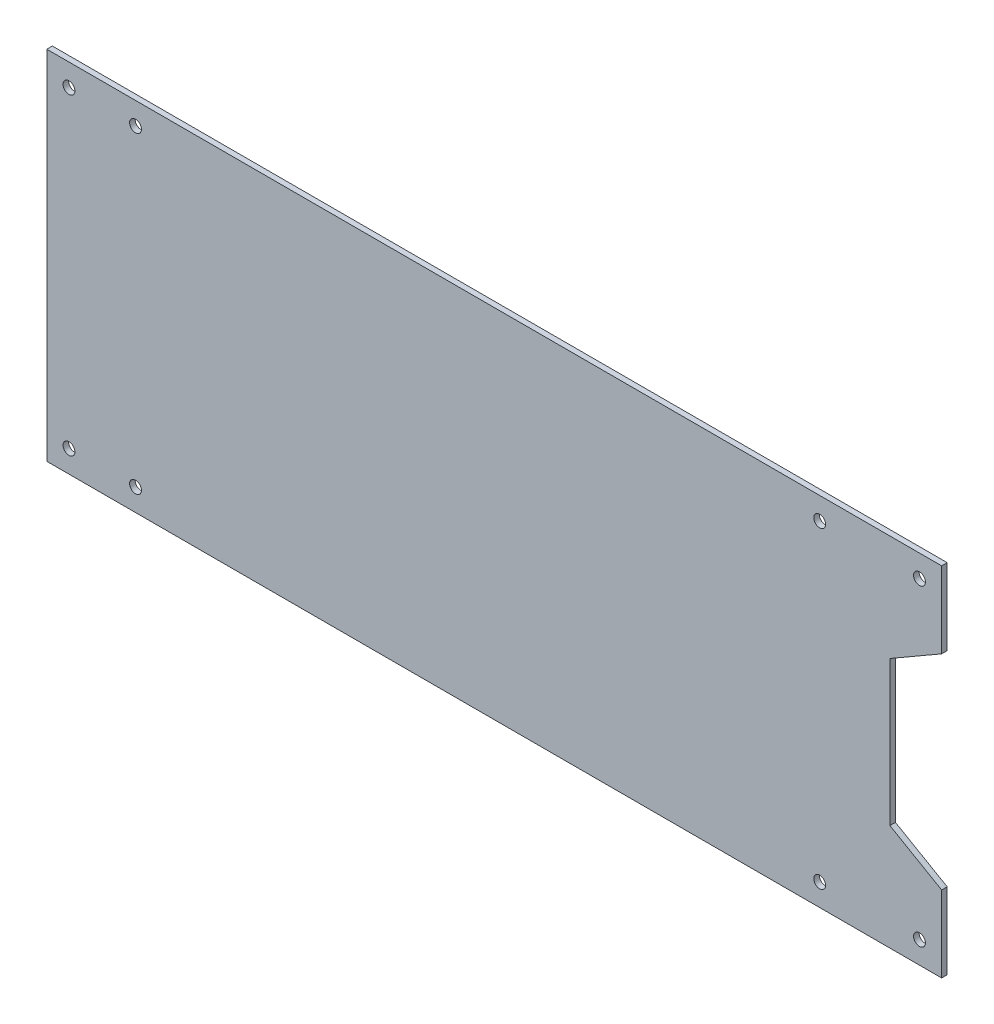
ISO-10303-21;
HEADER;
FILE_DESCRIPTION(('STEP AP214'),'2;1');
FILE_NAME('part.step','',(''),(''),'','','');
FILE_SCHEMA(('AUTOMOTIVE_DESIGN { 1 0 10303 214 1 1 1 1 }'));
ENDSEC;
DATA;
#1=APPLICATION_CONTEXT('core data for automotive mechanical design processes');
#2=APPLICATION_PROTOCOL_DEFINITION('international standard','automotive_design',2000,#1);
#3=PRODUCT_CONTEXT('',#1,'mechanical');
#4=PRODUCT('Part','Part','',(#3));
#5=PRODUCT_RELATED_PRODUCT_CATEGORY('part','',(#4));
#6=PRODUCT_DEFINITION_FORMATION('','',#4);
#7=PRODUCT_DEFINITION_CONTEXT('part definition',#1,'design');
#8=PRODUCT_DEFINITION('design','',#6,#7);
#9=PRODUCT_DEFINITION_SHAPE('','',#8);
#10=(LENGTH_UNIT() NAMED_UNIT(*) SI_UNIT(.MILLI.,.METRE.));
#11=(NAMED_UNIT(*) PLANE_ANGLE_UNIT() SI_UNIT($,.RADIAN.));
#12=(NAMED_UNIT(*) SI_UNIT($,.STERADIAN.) SOLID_ANGLE_UNIT());
#13=UNCERTAINTY_MEASURE_WITH_UNIT(LENGTH_MEASURE(1.E-05),#10,'distance_accuracy_value','');
#14=(GEOMETRIC_REPRESENTATION_CONTEXT(3) GLOBAL_UNCERTAINTY_ASSIGNED_CONTEXT((#13)) GLOBAL_UNIT_ASSIGNED_CONTEXT((#10,
#11,#12)) REPRESENTATION_CONTEXT('',''));
#15=CARTESIAN_POINT('',(0.,0.,0.));
#16=DIRECTION('',(0.,0.,1.));
#17=DIRECTION('',(1.,0.,0.));
#18=AXIS2_PLACEMENT_3D('',#15,#16,#17);
#19=CARTESIAN_POINT('',(-828.47776474,608.080871165908,1.5));
#20=DIRECTION('',(1.,0.,0.));
#21=DIRECTION('',(0.,0.,-1.));
#22=AXIS2_PLACEMENT_3D('',#19,#20,#21);
#23=PLANE('',#22);
#24=DIRECTION('',(0.,-1.,0.));
#25=VECTOR('',#24,1.);
#26=CARTESIAN_POINT('',(-828.47776474,608.080871165908,0.));
#27=LINE('',#26,#25);
#28=CARTESIAN_POINT('',(-828.47776474,608.080871165908,0.));
#29=VERTEX_POINT('',#28);
#30=CARTESIAN_POINT('',(-828.47776474,511.53002929687,0.));
#31=VERTEX_POINT('',#30);
#32=EDGE_CURVE('E142',#29,#31,#27,.T.);
#33=ORIENTED_EDGE('',*,*,#32,.T.);
#34=DIRECTION('',(0.,0.,-1.));
#35=VECTOR('',#34,1.);
#36=CARTESIAN_POINT('',(-828.47776474,511.53002929687,1.5));
#37=LINE('',#36,#35);
#38=CARTESIAN_POINT('',(-828.47776474,511.53002929687,1.5));
#39=VERTEX_POINT('',#38);
#40=EDGE_CURVE('E13',#39,#31,#37,.T.);
#41=ORIENTED_EDGE('',*,*,#40,.F.);
#42=DIRECTION('',(0.,-1.,0.));
#43=VECTOR('',#42,1.);
#44=CARTESIAN_POINT('',(-828.47776474,608.080871165908,1.5));
#45=LINE('',#44,#43);
#46=CARTESIAN_POINT('',(-828.47776474,608.080871165908,1.5));
#47=VERTEX_POINT('',#46);
#48=EDGE_CURVE('E156',#47,#39,#45,.T.);
#49=ORIENTED_EDGE('',*,*,#48,.F.);
#50=DIRECTION('',(0.,0.,-1.));
#51=VECTOR('',#50,1.);
#52=CARTESIAN_POINT('',(-828.47776474,608.080871165908,1.5));
#53=LINE('',#52,#51);
#54=EDGE_CURVE('E138',#47,#29,#53,.T.);
#55=ORIENTED_EDGE('',*,*,#54,.T.);
#56=EDGE_LOOP('',(#33,#41,#49,#55));
#57=FACE_BOUND('',#56,.T.);
#58=ADVANCED_FACE('F44',(#57),#23,.F.);
#59=CARTESIAN_POINT('',(-828.47776474,511.53002929687,1.5));
#60=DIRECTION('',(0.,1.,0.));
#61=DIRECTION('',(0.,0.,1.));
#62=AXIS2_PLACEMENT_3D('',#59,#60,#61);
#63=PLANE('',#62);
#64=DIRECTION('',(1.,0.,0.));
#65=VECTOR('',#64,1.);
#66=CARTESIAN_POINT('',(-828.47776474,511.53002929687,0.));
#67=LINE('',#66,#65);
#68=CARTESIAN_POINT('',(-586.41400146484,511.53002929687,0.));
#69=VERTEX_POINT('',#68);
#70=EDGE_CURVE('E145',#31,#69,#67,.T.);
#71=ORIENTED_EDGE('',*,*,#70,.T.);
#72=DIRECTION('',(0.,0.,-1.));
#73=VECTOR('',#72,1.);
#74=CARTESIAN_POINT('',(-586.41400146484,511.53002929687,1.5));
#75=LINE('',#74,#73);
#76=CARTESIAN_POINT('',(-586.41400146484,511.53002929687,1.5));
#77=VERTEX_POINT('',#76);
#78=EDGE_CURVE('E53',#77,#69,#75,.T.);
#79=ORIENTED_EDGE('',*,*,#78,.F.);
#80=DIRECTION('',(1.,0.,0.));
#81=VECTOR('',#80,1.);
#82=CARTESIAN_POINT('',(-828.47776474,511.53002929687,1.5));
#83=LINE('',#82,#81);
#84=EDGE_CURVE('E105',#39,#77,#83,.T.);
#85=ORIENTED_EDGE('',*,*,#84,.F.);
#86=ORIENTED_EDGE('',*,*,#40,.T.);
#87=EDGE_LOOP('',(#71,#79,#85,#86));
#88=FACE_BOUND('',#87,.T.);
#89=ADVANCED_FACE('F209',(#88),#63,.F.);
#90=CARTESIAN_POINT('',(-586.41400146484,511.53002929687,1.5));
#91=DIRECTION('',(-1.,0.,0.));
#92=DIRECTION('',(0.,-1.,0.));
#93=AXIS2_PLACEMENT_3D('',#90,#91,#92);
#94=PLANE('',#93);
#95=DIRECTION('',(0.,1.,0.));
#96=VECTOR('',#95,1.);
#97=CARTESIAN_POINT('',(-586.41400146484,511.53002929687,0.));
#98=LINE('',#97,#96);
#99=CARTESIAN_POINT('',(-586.41400146484,532.148831450387,0.));
#100=VERTEX_POINT('',#99);
#101=EDGE_CURVE('E147',#69,#100,#98,.T.);
#102=ORIENTED_EDGE('',*,*,#101,.T.);
#103=DIRECTION('',(0.,0.,-1.));
#104=VECTOR('',#103,1.);
#105=CARTESIAN_POINT('',(-586.41400146484,532.148831450387,1.5));
#106=LINE('',#105,#104);
#107=CARTESIAN_POINT('',(-586.41400146484,532.148831450387,1.5));
#108=VERTEX_POINT('',#107);
#109=EDGE_CURVE('E163',#108,#100,#106,.T.);
#110=ORIENTED_EDGE('',*,*,#109,.F.);
#111=DIRECTION('',(0.,1.,0.));
#112=VECTOR('',#111,1.);
#113=CARTESIAN_POINT('',(-586.41400146484,511.53002929687,1.5));
#114=LINE('',#113,#112);
#115=EDGE_CURVE('E224',#77,#108,#114,.T.);
#116=ORIENTED_EDGE('',*,*,#115,.F.);
#117=ORIENTED_EDGE('',*,*,#78,.T.);
#118=EDGE_LOOP('',(#102,#110,#116,#117));
#119=FACE_BOUND('',#118,.T.);
#120=ADVANCED_FACE('F214',(#119),#94,.F.);
#121=CARTESIAN_POINT('',(-586.41400146484,532.148831450387,1.5));
#122=DIRECTION('',(-0.500000000000004,-0.866025403784436,0.));
#123=DIRECTION('',(0.866025403784436,-0.500000000000004,0.));
#124=AXIS2_PLACEMENT_3D('',#121,#122,#123);
#125=PLANE('',#124);
#126=DIRECTION('',(-0.866025403784436,0.500000000000004,0.));
#127=VECTOR('',#126,1.);
#128=CARTESIAN_POINT('',(-586.41400146484,532.148831450387,0.));
#129=LINE('',#128,#127);
#130=CARTESIAN_POINT('',(-600.41400146484,540.231735219042,0.));
#131=VERTEX_POINT('',#130);
#132=EDGE_CURVE('E149',#100,#131,#129,.T.);
#133=ORIENTED_EDGE('',*,*,#132,.T.);
#134=DIRECTION('',(0.,0.,-1.));
#135=VECTOR('',#134,1.);
#136=CARTESIAN_POINT('',(-600.41400146484,540.231735219042,1.5));
#137=LINE('',#136,#135);
#138=CARTESIAN_POINT('',(-600.41400146484,540.231735219042,1.5));
#139=VERTEX_POINT('',#138);
#140=EDGE_CURVE('E160',#139,#131,#137,.T.);
#141=ORIENTED_EDGE('',*,*,#140,.F.);
#142=DIRECTION('',(-0.866025403784436,0.500000000000004,0.));
#143=VECTOR('',#142,1.);
#144=CARTESIAN_POINT('',(-586.41400146484,532.148831450387,1.5));
#145=LINE('',#144,#143);
#146=EDGE_CURVE('E226',#108,#139,#145,.T.);
#147=ORIENTED_EDGE('',*,*,#146,.F.);
#148=ORIENTED_EDGE('',*,*,#109,.T.);
#149=EDGE_LOOP('',(#133,#141,#147,#148));
#150=FACE_BOUND('',#149,.T.);
#151=ADVANCED_FACE('F291',(#150),#125,.F.);
#152=CARTESIAN_POINT('',(-600.41400146484,540.231735219042,1.5));
#153=DIRECTION('',(-1.,0.,0.));
#154=DIRECTION('',(0.,-1.,0.));
#155=AXIS2_PLACEMENT_3D('',#152,#153,#154);
#156=PLANE('',#155);
#157=DIRECTION('',(0.,1.,0.));
#158=VECTOR('',#157,1.);
#159=CARTESIAN_POINT('',(-600.41400146484,540.231735219042,0.));
#160=LINE('',#159,#158);
#161=CARTESIAN_POINT('',(-600.41400146484,579.379165243736,0.));
#162=VERTEX_POINT('',#161);
#163=EDGE_CURVE('E151',#131,#162,#160,.T.);
#164=ORIENTED_EDGE('',*,*,#163,.T.);
#165=DIRECTION('',(0.,0.,-1.));
#166=VECTOR('',#165,1.);
#167=CARTESIAN_POINT('',(-600.41400146484,579.379165243736,1.5));
#168=LINE('',#167,#166);
#169=CARTESIAN_POINT('',(-600.41400146484,579.379165243736,1.5));
#170=VERTEX_POINT('',#169);
#171=EDGE_CURVE('E133',#170,#162,#168,.T.);
#172=ORIENTED_EDGE('',*,*,#171,.F.);
#173=DIRECTION('',(0.,1.,0.));
#174=VECTOR('',#173,1.);
#175=CARTESIAN_POINT('',(-600.41400146484,540.231735219042,1.5));
#176=LINE('',#175,#174);
#177=EDGE_CURVE('E124',#139,#170,#176,.T.);
#178=ORIENTED_EDGE('',*,*,#177,.F.);
#179=ORIENTED_EDGE('',*,*,#140,.T.);
#180=EDGE_LOOP('',(#164,#172,#178,#179));
#181=FACE_BOUND('',#180,.T.);
#182=ADVANCED_FACE('F288',(#181),#156,.F.);
#183=CARTESIAN_POINT('',(-600.41400146484,579.379165243736,1.5));
#184=DIRECTION('',(-0.499999999999994,0.866025403784442,0.));
#185=DIRECTION('',(-0.866025403784442,-0.499999999999994,0.));
#186=AXIS2_PLACEMENT_3D('',#183,#184,#185);
#187=PLANE('',#186);
#188=DIRECTION('',(0.866025403784442,0.499999999999994,0.));
#189=VECTOR('',#188,1.);
#190=CARTESIAN_POINT('',(-600.41400146484,579.379165243736,0.));
#191=LINE('',#190,#189);
#192=CARTESIAN_POINT('',(-586.41400146484,587.462069012391,0.));
#193=VERTEX_POINT('',#192);
#194=EDGE_CURVE('E132',#162,#193,#191,.T.);
#195=ORIENTED_EDGE('',*,*,#194,.T.);
#196=DIRECTION('',(0.,0.,-1.));
#197=VECTOR('',#196,1.);
#198=CARTESIAN_POINT('',(-586.41400146484,587.462069012391,1.5));
#199=LINE('',#198,#197);
#200=CARTESIAN_POINT('',(-586.41400146484,587.462069012391,1.5));
#201=VERTEX_POINT('',#200);
#202=EDGE_CURVE('E129',#201,#193,#199,.T.);
#203=ORIENTED_EDGE('',*,*,#202,.F.);
#204=DIRECTION('',(0.866025403784442,0.499999999999994,0.));
#205=VECTOR('',#204,1.);
#206=CARTESIAN_POINT('',(-600.41400146484,579.379165243736,1.5));
#207=LINE('',#206,#205);
#208=EDGE_CURVE('E118',#170,#201,#207,.T.);
#209=ORIENTED_EDGE('',*,*,#208,.F.);
#210=ORIENTED_EDGE('',*,*,#171,.T.);
#211=EDGE_LOOP('',(#195,#203,#209,#210));
#212=FACE_BOUND('',#211,.T.);
#213=ADVANCED_FACE('F130',(#212),#187,.F.);
#214=CARTESIAN_POINT('',(-586.41400146484,587.462069012391,1.5));
#215=DIRECTION('',(-1.,0.,0.));
#216=DIRECTION('',(0.,-1.,0.));
#217=AXIS2_PLACEMENT_3D('',#214,#215,#216);
#218=PLANE('',#217);
#219=DIRECTION('',(0.,1.,0.));
#220=VECTOR('',#219,1.);
#221=CARTESIAN_POINT('',(-586.41400146484,587.462069012391,0.));
#222=LINE('',#221,#220);
#223=CARTESIAN_POINT('',(-586.41400146484,608.080871165908,0.));
#224=VERTEX_POINT('',#223);
#225=EDGE_CURVE('E91',#193,#224,#222,.T.);
#226=ORIENTED_EDGE('',*,*,#225,.T.);
#227=DIRECTION('',(0.,0.,-1.));
#228=VECTOR('',#227,1.);
#229=CARTESIAN_POINT('',(-586.41400146484,608.080871165908,1.5));
#230=LINE('',#229,#228);
#231=CARTESIAN_POINT('',(-586.41400146484,608.080871165908,1.5));
#232=VERTEX_POINT('',#231);
#233=EDGE_CURVE('E134',#232,#224,#230,.T.);
#234=ORIENTED_EDGE('',*,*,#233,.F.);
#235=DIRECTION('',(0.,1.,0.));
#236=VECTOR('',#235,1.);
#237=CARTESIAN_POINT('',(-586.41400146484,587.462069012391,1.5));
#238=LINE('',#237,#236);
#239=EDGE_CURVE('E122',#201,#232,#238,.T.);
#240=ORIENTED_EDGE('',*,*,#239,.F.);
#241=ORIENTED_EDGE('',*,*,#202,.T.);
#242=EDGE_LOOP('',(#226,#234,#240,#241));
#243=FACE_BOUND('',#242,.T.);
#244=ADVANCED_FACE('F136',(#243),#218,.F.);
#245=CARTESIAN_POINT('',(-586.41400146484,608.080871165908,1.5));
#246=DIRECTION('',(0.,-1.,0.));
#247=DIRECTION('',(0.,0.,-1.));
#248=AXIS2_PLACEMENT_3D('',#245,#246,#247);
#249=PLANE('',#248);
#250=DIRECTION('',(-1.,0.,0.));
#251=VECTOR('',#250,1.);
#252=CARTESIAN_POINT('',(-586.41400146484,608.080871165908,0.));
#253=LINE('',#252,#251);
#254=EDGE_CURVE('E97',#224,#29,#253,.T.);
#255=ORIENTED_EDGE('',*,*,#254,.T.);
#256=ORIENTED_EDGE('',*,*,#54,.F.);
#257=DIRECTION('',(-1.,0.,0.));
#258=VECTOR('',#257,1.);
#259=CARTESIAN_POINT('',(-586.41400146484,608.080871165908,1.5));
#260=LINE('',#259,#258);
#261=EDGE_CURVE('E62',#232,#47,#260,.T.);
#262=ORIENTED_EDGE('',*,*,#261,.F.);
#263=ORIENTED_EDGE('',*,*,#233,.T.);
#264=EDGE_LOOP('',(#255,#256,#262,#263));
#265=FACE_BOUND('',#264,.T.);
#266=ADVANCED_FACE('F260',(#265),#249,.F.);
#267=CARTESIAN_POINT('',(0.,0.,1.5));
#268=DIRECTION('',(0.,0.,1.));
#269=DIRECTION('',(1.,0.,0.));
#270=AXIS2_PLACEMENT_3D('',#267,#268,#269);
#271=PLANE('',#270);
#272=CARTESIAN_POINT('',(-619.41400146484,602.080871165908,1.5));
#273=DIRECTION('',(0.,0.,1.));
#274=DIRECTION('',(1.,0.,0.));
#275=AXIS2_PLACEMENT_3D('',#272,#273,#274);
#276=CIRCLE('',#275,1.60000000000003);
#277=CARTESIAN_POINT('',(-617.81400146484,602.080871165908,1.5));
#278=VERTEX_POINT('',#277);
#279=EDGE_CURVE('E241',#278,#278,#276,.T.);
#280=ORIENTED_EDGE('',*,*,#279,.F.);
#281=EDGE_LOOP('',(#280));
#282=FACE_BOUND('',#281,.T.);
#283=CARTESIAN_POINT('',(-804.47776474,517.53002929687,1.5));
#284=DIRECTION('',(0.,0.,1.));
#285=DIRECTION('',(1.,0.,0.));
#286=AXIS2_PLACEMENT_3D('',#283,#284,#285);
#287=CIRCLE('',#286,1.60000000000003);
#288=CARTESIAN_POINT('',(-802.87776474,517.53002929687,1.5));
#289=VERTEX_POINT('',#288);
#290=EDGE_CURVE('E238',#289,#289,#287,.T.);
#291=ORIENTED_EDGE('',*,*,#290,.F.);
#292=EDGE_LOOP('',(#291));
#293=FACE_BOUND('',#292,.T.);
#294=CARTESIAN_POINT('',(-822.47776474,517.53002929687,1.5));
#295=DIRECTION('',(0.,0.,1.));
#296=DIRECTION('',(1.,0.,0.));
#297=AXIS2_PLACEMENT_3D('',#294,#295,#296);
#298=CIRCLE('',#297,1.60000000000003);
#299=CARTESIAN_POINT('',(-820.87776474,517.53002929687,1.5));
#300=VERTEX_POINT('',#299);
#301=EDGE_CURVE('E235',#300,#300,#298,.T.);
#302=ORIENTED_EDGE('',*,*,#301,.F.);
#303=EDGE_LOOP('',(#302));
#304=FACE_BOUND('',#303,.T.);
#305=CARTESIAN_POINT('',(-804.47776474,602.080871165908,1.5));
#306=DIRECTION('',(0.,0.,1.));
#307=DIRECTION('',(1.,0.,0.));
#308=AXIS2_PLACEMENT_3D('',#305,#306,#307);
#309=CIRCLE('',#308,1.60000000000003);
#310=CARTESIAN_POINT('',(-802.87776474,602.080871165908,1.5));
#311=VERTEX_POINT('',#310);
#312=EDGE_CURVE('E234',#311,#311,#309,.T.);
#313=ORIENTED_EDGE('',*,*,#312,.F.);
#314=EDGE_LOOP('',(#313));
#315=FACE_BOUND('',#314,.T.);
#316=CARTESIAN_POINT('',(-592.41400146484,517.53002929687,1.5));
#317=DIRECTION('',(0.,0.,1.));
#318=DIRECTION('',(1.,0.,0.));
#319=AXIS2_PLACEMENT_3D('',#316,#317,#318);
#320=CIRCLE('',#319,1.60000000000003);
#321=CARTESIAN_POINT('',(-590.81400146484,517.53002929687,1.5));
#322=VERTEX_POINT('',#321);
#323=EDGE_CURVE('E249',#322,#322,#320,.T.);
#324=ORIENTED_EDGE('',*,*,#323,.F.);
#325=EDGE_LOOP('',(#324));
#326=FACE_BOUND('',#325,.T.);
#327=CARTESIAN_POINT('',(-619.41400146484,517.53002929687,1.5));
#328=DIRECTION('',(0.,0.,1.));
#329=DIRECTION('',(1.,0.,0.));
#330=AXIS2_PLACEMENT_3D('',#327,#328,#329);
#331=CIRCLE('',#330,1.60000000000003);
#332=CARTESIAN_POINT('',(-617.81400146484,517.53002929687,1.5));
#333=VERTEX_POINT('',#332);
#334=EDGE_CURVE('E246',#333,#333,#331,.T.);
#335=ORIENTED_EDGE('',*,*,#334,.F.);
#336=EDGE_LOOP('',(#335));
#337=FACE_BOUND('',#336,.T.);
#338=CARTESIAN_POINT('',(-592.41400146484,602.080871165908,1.5));
#339=DIRECTION('',(0.,0.,1.));
#340=DIRECTION('',(1.,0.,0.));
#341=AXIS2_PLACEMENT_3D('',#338,#339,#340);
#342=CIRCLE('',#341,1.60000000000003);
#343=CARTESIAN_POINT('',(-590.81400146484,602.080871165908,1.5));
#344=VERTEX_POINT('',#343);
#345=EDGE_CURVE('E243',#344,#344,#342,.T.);
#346=ORIENTED_EDGE('',*,*,#345,.F.);
#347=EDGE_LOOP('',(#346));
#348=FACE_BOUND('',#347,.T.);
#349=CARTESIAN_POINT('',(-822.47776474,602.080871165908,1.5));
#350=DIRECTION('',(0.,0.,1.));
#351=DIRECTION('',(1.,0.,0.));
#352=AXIS2_PLACEMENT_3D('',#349,#350,#351);
#353=CIRCLE('',#352,1.60000000000003);
#354=CARTESIAN_POINT('',(-820.87776474,602.080871165908,1.5));
#355=VERTEX_POINT('',#354);
#356=EDGE_CURVE('E172',#355,#355,#353,.T.);
#357=ORIENTED_EDGE('',*,*,#356,.F.);
#358=EDGE_LOOP('',(#357));
#359=FACE_BOUND('',#358,.T.);
#360=ORIENTED_EDGE('',*,*,#48,.T.);
#361=ORIENTED_EDGE('',*,*,#84,.T.);
#362=ORIENTED_EDGE('',*,*,#115,.T.);
#363=ORIENTED_EDGE('',*,*,#146,.T.);
#364=ORIENTED_EDGE('',*,*,#177,.T.);
#365=ORIENTED_EDGE('',*,*,#208,.T.);
#366=ORIENTED_EDGE('',*,*,#239,.T.);
#367=ORIENTED_EDGE('',*,*,#261,.T.);
#368=EDGE_LOOP('',(#360,#361,#362,#363,#364,#365,#366,#367));
#369=FACE_BOUND('',#368,.T.);
#370=ADVANCED_FACE('F120',(#282,#293,#304,#315,#326,#337,#348,#359,#369),#271,.T.);
#371=CARTESIAN_POINT('',(0.,0.,0.));
#372=DIRECTION('',(0.,0.,1.));
#373=DIRECTION('',(1.,0.,0.));
#374=AXIS2_PLACEMENT_3D('',#371,#372,#373);
#375=PLANE('',#374);
#376=CARTESIAN_POINT('',(-619.41400146484,602.080871165908,0.));
#377=DIRECTION('',(0.,0.,1.));
#378=DIRECTION('',(1.,0.,0.));
#379=AXIS2_PLACEMENT_3D('',#376,#377,#378);
#380=CIRCLE('',#379,1.60000000000003);
#381=CARTESIAN_POINT('',(-617.81400146484,602.080871165908,0.));
#382=VERTEX_POINT('',#381);
#383=EDGE_CURVE('E47',#382,#382,#380,.T.);
#384=ORIENTED_EDGE('',*,*,#383,.T.);
#385=EDGE_LOOP('',(#384));
#386=FACE_BOUND('',#385,.T.);
#387=CARTESIAN_POINT('',(-804.47776474,517.53002929687,0.));
#388=DIRECTION('',(0.,0.,1.));
#389=DIRECTION('',(1.,0.,0.));
#390=AXIS2_PLACEMENT_3D('',#387,#388,#389);
#391=CIRCLE('',#390,1.60000000000003);
#392=CARTESIAN_POINT('',(-802.87776474,517.53002929687,0.));
#393=VERTEX_POINT('',#392);
#394=EDGE_CURVE('E186',#393,#393,#391,.T.);
#395=ORIENTED_EDGE('',*,*,#394,.T.);
#396=EDGE_LOOP('',(#395));
#397=FACE_BOUND('',#396,.T.);
#398=CARTESIAN_POINT('',(-822.47776474,517.53002929687,0.));
#399=DIRECTION('',(0.,0.,1.));
#400=DIRECTION('',(1.,0.,0.));
#401=AXIS2_PLACEMENT_3D('',#398,#399,#400);
#402=CIRCLE('',#401,1.60000000000003);
#403=CARTESIAN_POINT('',(-820.87776474,517.53002929687,0.));
#404=VERTEX_POINT('',#403);
#405=EDGE_CURVE('E184',#404,#404,#402,.T.);
#406=ORIENTED_EDGE('',*,*,#405,.T.);
#407=EDGE_LOOP('',(#406));
#408=FACE_BOUND('',#407,.T.);
#409=CARTESIAN_POINT('',(-804.47776474,602.080871165908,0.));
#410=DIRECTION('',(0.,0.,1.));
#411=DIRECTION('',(1.,0.,0.));
#412=AXIS2_PLACEMENT_3D('',#409,#410,#411);
#413=CIRCLE('',#412,1.60000000000003);
#414=CARTESIAN_POINT('',(-802.87776474,602.080871165908,0.));
#415=VERTEX_POINT('',#414);
#416=EDGE_CURVE('E181',#415,#415,#413,.T.);
#417=ORIENTED_EDGE('',*,*,#416,.T.);
#418=EDGE_LOOP('',(#417));
#419=FACE_BOUND('',#418,.T.);
#420=CARTESIAN_POINT('',(-592.41400146484,517.53002929687,0.));
#421=DIRECTION('',(0.,0.,1.));
#422=DIRECTION('',(1.,0.,0.));
#423=AXIS2_PLACEMENT_3D('',#420,#421,#422);
#424=CIRCLE('',#423,1.60000000000003);
#425=CARTESIAN_POINT('',(-590.81400146484,517.53002929687,0.));
#426=VERTEX_POINT('',#425);
#427=EDGE_CURVE('E178',#426,#426,#424,.T.);
#428=ORIENTED_EDGE('',*,*,#427,.T.);
#429=EDGE_LOOP('',(#428));
#430=FACE_BOUND('',#429,.T.);
#431=CARTESIAN_POINT('',(-619.41400146484,517.53002929687,0.));
#432=DIRECTION('',(0.,0.,1.));
#433=DIRECTION('',(1.,0.,0.));
#434=AXIS2_PLACEMENT_3D('',#431,#432,#433);
#435=CIRCLE('',#434,1.60000000000003);
#436=CARTESIAN_POINT('',(-617.81400146484,517.53002929687,0.));
#437=VERTEX_POINT('',#436);
#438=EDGE_CURVE('E175',#437,#437,#435,.T.);
#439=ORIENTED_EDGE('',*,*,#438,.T.);
#440=EDGE_LOOP('',(#439));
#441=FACE_BOUND('',#440,.T.);
#442=CARTESIAN_POINT('',(-592.41400146484,602.080871165908,0.));
#443=DIRECTION('',(0.,0.,1.));
#444=DIRECTION('',(1.,0.,0.));
#445=AXIS2_PLACEMENT_3D('',#442,#443,#444);
#446=CIRCLE('',#445,1.60000000000003);
#447=CARTESIAN_POINT('',(-590.81400146484,602.080871165908,0.));
#448=VERTEX_POINT('',#447);
#449=EDGE_CURVE('E171',#448,#448,#446,.T.);
#450=ORIENTED_EDGE('',*,*,#449,.T.);
#451=EDGE_LOOP('',(#450));
#452=FACE_BOUND('',#451,.T.);
#453=CARTESIAN_POINT('',(-822.47776474,602.080871165908,0.));
#454=DIRECTION('',(0.,0.,1.));
#455=DIRECTION('',(1.,0.,0.));
#456=AXIS2_PLACEMENT_3D('',#453,#454,#455);
#457=CIRCLE('',#456,1.60000000000003);
#458=CARTESIAN_POINT('',(-820.87776474,602.080871165908,0.));
#459=VERTEX_POINT('',#458);
#460=EDGE_CURVE('E168',#459,#459,#457,.T.);
#461=ORIENTED_EDGE('',*,*,#460,.T.);
#462=EDGE_LOOP('',(#461));
#463=FACE_BOUND('',#462,.T.);
#464=ORIENTED_EDGE('',*,*,#32,.F.);
#465=ORIENTED_EDGE('',*,*,#254,.F.);
#466=ORIENTED_EDGE('',*,*,#225,.F.);
#467=ORIENTED_EDGE('',*,*,#194,.F.);
#468=ORIENTED_EDGE('',*,*,#163,.F.);
#469=ORIENTED_EDGE('',*,*,#132,.F.);
#470=ORIENTED_EDGE('',*,*,#101,.F.);
#471=ORIENTED_EDGE('',*,*,#70,.F.);
#472=EDGE_LOOP('',(#464,#465,#466,#467,#468,#469,#470,#471));
#473=FACE_BOUND('',#472,.T.);
#474=ADVANCED_FACE('F193',(#386,#397,#408,#419,#430,#441,#452,#463,#473),#375,.F.);
#475=CARTESIAN_POINT('',(-822.47776474,602.080871165908,-2.));
#476=DIRECTION('',(0.,0.,1.));
#477=DIRECTION('',(1.,0.,0.));
#478=AXIS2_PLACEMENT_3D('',#475,#476,#477);
#479=CYLINDRICAL_SURFACE('',#478,1.60000000000003);
#480=ORIENTED_EDGE('',*,*,#356,.T.);
#481=EDGE_LOOP('',(#480));
#482=FACE_BOUND('',#481,.T.);
#483=ORIENTED_EDGE('',*,*,#460,.F.);
#484=EDGE_LOOP('',(#483));
#485=FACE_BOUND('',#484,.T.);
#486=ADVANCED_FACE('F269',(#482,#485),#479,.F.);
#487=CARTESIAN_POINT('',(-592.41400146484,602.080871165908,-2.));
#488=DIRECTION('',(0.,0.,1.));
#489=DIRECTION('',(1.,0.,0.));
#490=AXIS2_PLACEMENT_3D('',#487,#488,#489);
#491=CYLINDRICAL_SURFACE('',#490,1.60000000000003);
#492=ORIENTED_EDGE('',*,*,#345,.T.);
#493=EDGE_LOOP('',(#492));
#494=FACE_BOUND('',#493,.T.);
#495=ORIENTED_EDGE('',*,*,#449,.F.);
#496=EDGE_LOOP('',(#495));
#497=FACE_BOUND('',#496,.T.);
#498=ADVANCED_FACE('F272',(#494,#497),#491,.F.);
#499=CARTESIAN_POINT('',(-619.41400146484,517.53002929687,-2.));
#500=DIRECTION('',(0.,0.,1.));
#501=DIRECTION('',(1.,0.,0.));
#502=AXIS2_PLACEMENT_3D('',#499,#500,#501);
#503=CYLINDRICAL_SURFACE('',#502,1.60000000000003);
#504=ORIENTED_EDGE('',*,*,#334,.T.);
#505=EDGE_LOOP('',(#504));
#506=FACE_BOUND('',#505,.T.);
#507=ORIENTED_EDGE('',*,*,#438,.F.);
#508=EDGE_LOOP('',(#507));
#509=FACE_BOUND('',#508,.T.);
#510=ADVANCED_FACE('F340',(#506,#509),#503,.F.);
#511=CARTESIAN_POINT('',(-592.41400146484,517.53002929687,-2.));
#512=DIRECTION('',(0.,0.,1.));
#513=DIRECTION('',(1.,0.,0.));
#514=AXIS2_PLACEMENT_3D('',#511,#512,#513);
#515=CYLINDRICAL_SURFACE('',#514,1.60000000000003);
#516=ORIENTED_EDGE('',*,*,#323,.T.);
#517=EDGE_LOOP('',(#516));
#518=FACE_BOUND('',#517,.T.);
#519=ORIENTED_EDGE('',*,*,#427,.F.);
#520=EDGE_LOOP('',(#519));
#521=FACE_BOUND('',#520,.T.);
#522=ADVANCED_FACE('F255',(#518,#521),#515,.F.);
#523=CARTESIAN_POINT('',(-804.47776474,602.080871165908,-2.));
#524=DIRECTION('',(0.,0.,1.));
#525=DIRECTION('',(1.,0.,0.));
#526=AXIS2_PLACEMENT_3D('',#523,#524,#525);
#527=CYLINDRICAL_SURFACE('',#526,1.60000000000003);
#528=ORIENTED_EDGE('',*,*,#312,.T.);
#529=EDGE_LOOP('',(#528));
#530=FACE_BOUND('',#529,.T.);
#531=ORIENTED_EDGE('',*,*,#416,.F.);
#532=EDGE_LOOP('',(#531));
#533=FACE_BOUND('',#532,.T.);
#534=ADVANCED_FACE('F355',(#530,#533),#527,.F.);
#535=CARTESIAN_POINT('',(-822.47776474,517.53002929687,-2.));
#536=DIRECTION('',(0.,0.,1.));
#537=DIRECTION('',(1.,0.,0.));
#538=AXIS2_PLACEMENT_3D('',#535,#536,#537);
#539=CYLINDRICAL_SURFACE('',#538,1.60000000000003);
#540=ORIENTED_EDGE('',*,*,#301,.T.);
#541=EDGE_LOOP('',(#540));
#542=FACE_BOUND('',#541,.T.);
#543=ORIENTED_EDGE('',*,*,#405,.F.);
#544=EDGE_LOOP('',(#543));
#545=FACE_BOUND('',#544,.T.);
#546=ADVANCED_FACE('F203',(#542,#545),#539,.F.);
#547=CARTESIAN_POINT('',(-804.47776474,517.53002929687,-2.));
#548=DIRECTION('',(0.,0.,1.));
#549=DIRECTION('',(1.,0.,0.));
#550=AXIS2_PLACEMENT_3D('',#547,#548,#549);
#551=CYLINDRICAL_SURFACE('',#550,1.60000000000003);
#552=ORIENTED_EDGE('',*,*,#290,.T.);
#553=EDGE_LOOP('',(#552));
#554=FACE_BOUND('',#553,.T.);
#555=ORIENTED_EDGE('',*,*,#394,.F.);
#556=EDGE_LOOP('',(#555));
#557=FACE_BOUND('',#556,.T.);
#558=ADVANCED_FACE('F197',(#554,#557),#551,.F.);
#559=CARTESIAN_POINT('',(-619.41400146484,602.080871165908,-2.));
#560=DIRECTION('',(0.,0.,1.));
#561=DIRECTION('',(1.,0.,0.));
#562=AXIS2_PLACEMENT_3D('',#559,#560,#561);
#563=CYLINDRICAL_SURFACE('',#562,1.60000000000003);
#564=ORIENTED_EDGE('',*,*,#279,.T.);
#565=EDGE_LOOP('',(#564));
#566=FACE_BOUND('',#565,.T.);
#567=ORIENTED_EDGE('',*,*,#383,.F.);
#568=EDGE_LOOP('',(#567));
#569=FACE_BOUND('',#568,.T.);
#570=ADVANCED_FACE('F195',(#566,#569),#563,.F.);
#571=CLOSED_SHELL('',(#58,#89,#120,#151,#182,#213,#244,#266,#370,#474,#486,#498,#510,#522,#534,
#546,#558,#570));
#572=MANIFOLD_SOLID_BREP('B2',#571);
#573=ADVANCED_BREP_SHAPE_REPRESENTATION('',(#18,#572),#14);
#574=SHAPE_DEFINITION_REPRESENTATION(#9,#573);
ENDSEC;
END-ISO-10303-21;
